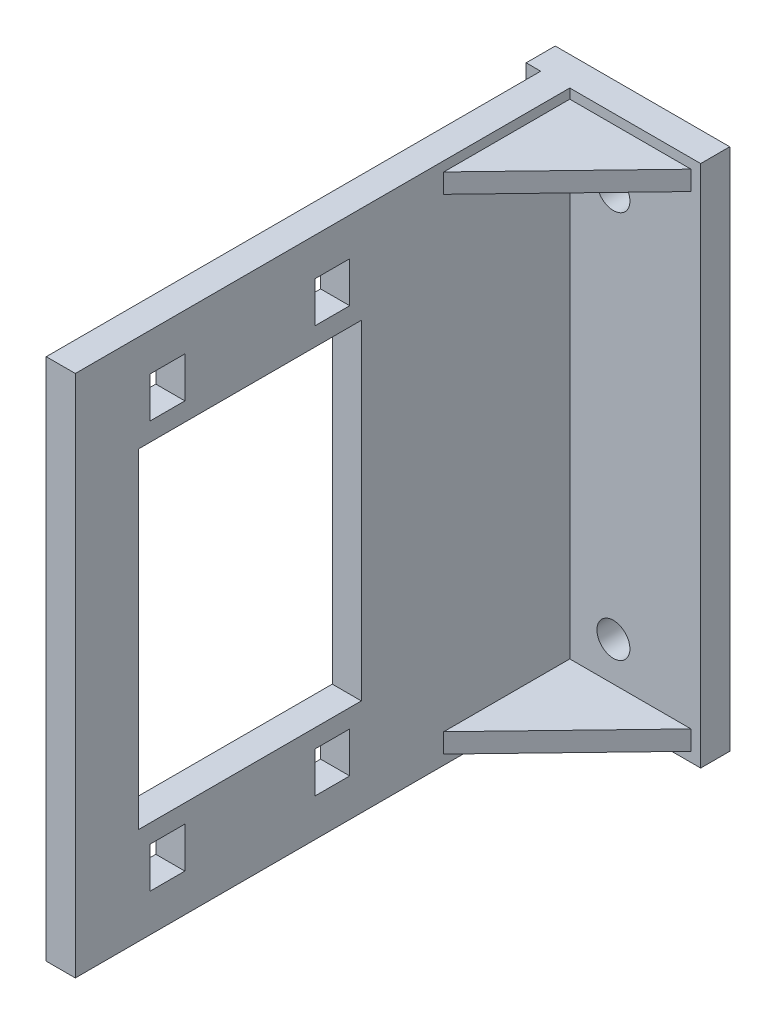
ISO-10303-21;
HEADER;
FILE_DESCRIPTION(('STEP AP214'),'2;1');
FILE_NAME('part.step','',(''),(''),'','','');
FILE_SCHEMA(('AUTOMOTIVE_DESIGN { 1 0 10303 214 1 1 1 1 }'));
ENDSEC;
DATA;
#1=APPLICATION_CONTEXT('core data for automotive mechanical design processes');
#2=APPLICATION_PROTOCOL_DEFINITION('international standard','automotive_design',2000,#1);
#3=PRODUCT_CONTEXT('',#1,'mechanical');
#4=PRODUCT('Part','Part','',(#3));
#5=PRODUCT_RELATED_PRODUCT_CATEGORY('part','',(#4));
#6=PRODUCT_DEFINITION_FORMATION('','',#4);
#7=PRODUCT_DEFINITION_CONTEXT('part definition',#1,'design');
#8=PRODUCT_DEFINITION('design','',#6,#7);
#9=PRODUCT_DEFINITION_SHAPE('','',#8);
#10=(LENGTH_UNIT() NAMED_UNIT(*) SI_UNIT(.MILLI.,.METRE.));
#11=(NAMED_UNIT(*) PLANE_ANGLE_UNIT() SI_UNIT($,.RADIAN.));
#12=(NAMED_UNIT(*) SI_UNIT($,.STERADIAN.) SOLID_ANGLE_UNIT());
#13=UNCERTAINTY_MEASURE_WITH_UNIT(LENGTH_MEASURE(1.E-05),#10,'distance_accuracy_value','');
#14=(GEOMETRIC_REPRESENTATION_CONTEXT(3) GLOBAL_UNCERTAINTY_ASSIGNED_CONTEXT((#13)) GLOBAL_UNIT_ASSIGNED_CONTEXT((#10,
#11,#12)) REPRESENTATION_CONTEXT('',''));
#15=CARTESIAN_POINT('',(0.,0.,0.));
#16=DIRECTION('',(0.,0.,1.));
#17=DIRECTION('',(1.,0.,0.));
#18=AXIS2_PLACEMENT_3D('',#15,#16,#17);
#19=CARTESIAN_POINT('',(0.,0.,3.));
#20=DIRECTION('',(0.,0.,1.));
#21=DIRECTION('',(1.,0.,0.));
#22=AXIS2_PLACEMENT_3D('',#19,#20,#21);
#23=PLANE('',#22);
#24=CARTESIAN_POINT('',(0.,-20.,3.));
#25=DIRECTION('',(0.,0.,1.));
#26=DIRECTION('',(1.,0.,0.));
#27=AXIS2_PLACEMENT_3D('',#24,#25,#26);
#28=CIRCLE('',#27,1.7);
#29=CARTESIAN_POINT('',(1.7,-20.,3.));
#30=VERTEX_POINT('',#29);
#31=EDGE_CURVE('E273',#30,#30,#28,.F.);
#32=ORIENTED_EDGE('',*,*,#31,.T.);
#33=EDGE_LOOP('',(#32));
#34=FACE_BOUND('',#33,.T.);
#35=CARTESIAN_POINT('',(0.,20.,3.));
#36=DIRECTION('',(0.,0.,1.));
#37=DIRECTION('',(1.,0.,0.));
#38=AXIS2_PLACEMENT_3D('',#35,#36,#37);
#39=CIRCLE('',#38,1.7);
#40=CARTESIAN_POINT('',(1.7,20.,3.));
#41=VERTEX_POINT('',#40);
#42=EDGE_CURVE('E511',#41,#41,#39,.F.);
#43=ORIENTED_EDGE('',*,*,#42,.T.);
#44=EDGE_LOOP('',(#43));
#45=FACE_BOUND('',#44,.T.);
#46=DIRECTION('',(0.,-1.,0.));
#47=VECTOR('',#46,1.);
#48=CARTESIAN_POINT('',(8.,26.,3.));
#49=LINE('',#48,#47);
#50=CARTESIAN_POINT('',(8.,26.,3.));
#51=VERTEX_POINT('',#50);
#52=CARTESIAN_POINT('',(8.,24.,3.));
#53=VERTEX_POINT('',#52);
#54=EDGE_CURVE('E57',#51,#53,#49,.T.);
#55=ORIENTED_EDGE('',*,*,#54,.T.);
#56=DIRECTION('',(-1.,0.,0.));
#57=VECTOR('',#56,1.);
#58=CARTESIAN_POINT('',(-4.5,24.,3.));
#59=LINE('',#58,#57);
#60=CARTESIAN_POINT('',(-4.5,24.,3.));
#61=VERTEX_POINT('',#60);
#62=EDGE_CURVE('E280',#53,#61,#59,.T.);
#63=ORIENTED_EDGE('',*,*,#62,.T.);
#64=DIRECTION('',(0.,1.,0.));
#65=VECTOR('',#64,1.);
#66=CARTESIAN_POINT('',(-4.5,-27.,3.));
#67=LINE('',#66,#65);
#68=CARTESIAN_POINT('',(-4.5,-24.,3.));
#69=VERTEX_POINT('',#68);
#70=EDGE_CURVE('E269',#69,#61,#67,.T.);
#71=ORIENTED_EDGE('',*,*,#70,.F.);
#72=DIRECTION('',(-1.,0.,0.));
#73=VECTOR('',#72,1.);
#74=CARTESIAN_POINT('',(-4.5,-24.,3.));
#75=LINE('',#74,#73);
#76=CARTESIAN_POINT('',(8.,-24.,3.));
#77=VERTEX_POINT('',#76);
#78=EDGE_CURVE('E297',#77,#69,#75,.T.);
#79=ORIENTED_EDGE('',*,*,#78,.F.);
#80=DIRECTION('',(0.,-1.,0.));
#81=VECTOR('',#80,1.);
#82=CARTESIAN_POINT('',(8.,-24.,3.));
#83=LINE('',#82,#81);
#84=CARTESIAN_POINT('',(8.,-26.,3.));
#85=VERTEX_POINT('',#84);
#86=EDGE_CURVE('E299',#77,#85,#83,.T.);
#87=ORIENTED_EDGE('',*,*,#86,.T.);
#88=DIRECTION('',(-1.,0.,0.));
#89=VECTOR('',#88,1.);
#90=CARTESIAN_POINT('',(-4.5,-26.,3.));
#91=LINE('',#90,#89);
#92=CARTESIAN_POINT('',(-4.5,-26.,3.));
#93=VERTEX_POINT('',#92);
#94=EDGE_CURVE('E293',#85,#93,#91,.T.);
#95=ORIENTED_EDGE('',*,*,#94,.T.);
#96=CARTESIAN_POINT('',(-4.5,-27.,3.));
#97=VERTEX_POINT('',#96);
#98=EDGE_CURVE('E411',#97,#93,#67,.T.);
#99=ORIENTED_EDGE('',*,*,#98,.F.);
#100=DIRECTION('',(1.,0.,0.));
#101=VECTOR('',#100,1.);
#102=CARTESIAN_POINT('',(-9.,-27.,3.));
#103=LINE('',#102,#101);
#104=CARTESIAN_POINT('',(9.,-27.,3.));
#105=VERTEX_POINT('',#104);
#106=EDGE_CURVE('E442',#97,#105,#103,.T.);
#107=ORIENTED_EDGE('',*,*,#106,.T.);
#108=DIRECTION('',(0.,1.,0.));
#109=VECTOR('',#108,1.);
#110=CARTESIAN_POINT('',(9.,-27.,3.));
#111=LINE('',#110,#109);
#112=CARTESIAN_POINT('',(9.,27.,3.));
#113=VERTEX_POINT('',#112);
#114=EDGE_CURVE('E443',#105,#113,#111,.T.);
#115=ORIENTED_EDGE('',*,*,#114,.T.);
#116=DIRECTION('',(-1.,0.,0.));
#117=VECTOR('',#116,1.);
#118=CARTESIAN_POINT('',(9.,27.,3.));
#119=LINE('',#118,#117);
#120=CARTESIAN_POINT('',(-4.5,27.,3.));
#121=VERTEX_POINT('',#120);
#122=EDGE_CURVE('E449',#113,#121,#119,.T.);
#123=ORIENTED_EDGE('',*,*,#122,.T.);
#124=CARTESIAN_POINT('',(-4.5,26.,3.));
#125=VERTEX_POINT('',#124);
#126=EDGE_CURVE('E421',#125,#121,#67,.T.);
#127=ORIENTED_EDGE('',*,*,#126,.F.);
#128=DIRECTION('',(-1.,0.,0.));
#129=VECTOR('',#128,1.);
#130=CARTESIAN_POINT('',(-4.5,26.,3.));
#131=LINE('',#130,#129);
#132=EDGE_CURVE('E61',#51,#125,#131,.T.);
#133=ORIENTED_EDGE('',*,*,#132,.F.);
#134=EDGE_LOOP('',(#55,#63,#71,#79,#87,#95,#99,#107,#115,#123,#127,#133));
#135=FACE_BOUND('',#134,.T.);
#136=ADVANCED_FACE('F39',(#34,#45,#135),#23,.T.);
#137=CARTESIAN_POINT('',(-7.5,27.,54.));
#138=DIRECTION('',(1.,0.,0.));
#139=DIRECTION('',(0.,0.,-1.));
#140=AXIS2_PLACEMENT_3D('',#137,#138,#139);
#141=PLANE('',#140);
#142=DIRECTION('',(0.,0.,1.));
#143=VECTOR('',#142,1.);
#144=CARTESIAN_POINT('',(-7.5,18.9,54.));
#145=LINE('',#144,#143);
#146=CARTESIAN_POINT('',(-7.5,18.9,25.7));
#147=VERTEX_POINT('',#146);
#148=CARTESIAN_POINT('',(-7.5,18.9,29.3));
#149=VERTEX_POINT('',#148);
#150=EDGE_CURVE('E380',#147,#149,#145,.T.);
#151=ORIENTED_EDGE('',*,*,#150,.F.);
#152=DIRECTION('',(0.,-1.,0.));
#153=VECTOR('',#152,1.);
#154=CARTESIAN_POINT('',(-7.5,27.,25.7));
#155=LINE('',#154,#153);
#156=CARTESIAN_POINT('',(-7.5,23.1,25.7));
#157=VERTEX_POINT('',#156);
#158=EDGE_CURVE('E374',#157,#147,#155,.T.);
#159=ORIENTED_EDGE('',*,*,#158,.F.);
#160=DIRECTION('',(0.,0.,-1.));
#161=VECTOR('',#160,1.);
#162=CARTESIAN_POINT('',(-7.5,23.1,54.));
#163=LINE('',#162,#161);
#164=CARTESIAN_POINT('',(-7.5,23.1,29.3));
#165=VERTEX_POINT('',#164);
#166=EDGE_CURVE('E373',#165,#157,#163,.T.);
#167=ORIENTED_EDGE('',*,*,#166,.F.);
#168=DIRECTION('',(0.,1.,0.));
#169=VECTOR('',#168,1.);
#170=CARTESIAN_POINT('',(-7.5,27.,29.3));
#171=LINE('',#170,#169);
#172=EDGE_CURVE('E371',#149,#165,#171,.T.);
#173=ORIENTED_EDGE('',*,*,#172,.F.);
#174=EDGE_LOOP('',(#151,#159,#167,#173));
#175=FACE_BOUND('',#174,.T.);
#176=DIRECTION('',(0.,0.,1.));
#177=VECTOR('',#176,1.);
#178=CARTESIAN_POINT('',(-7.5,-23.1,54.));
#179=LINE('',#178,#177);
#180=CARTESIAN_POINT('',(-7.5,-23.1,25.7));
#181=VERTEX_POINT('',#180);
#182=CARTESIAN_POINT('',(-7.5,-23.1,29.3));
#183=VERTEX_POINT('',#182);
#184=EDGE_CURVE('E356',#181,#183,#179,.T.);
#185=ORIENTED_EDGE('',*,*,#184,.F.);
#186=DIRECTION('',(0.,-1.,0.));
#187=VECTOR('',#186,1.);
#188=CARTESIAN_POINT('',(-7.5,27.,25.7));
#189=LINE('',#188,#187);
#190=CARTESIAN_POINT('',(-7.5,-18.9,25.7));
#191=VERTEX_POINT('',#190);
#192=EDGE_CURVE('E359',#191,#181,#189,.T.);
#193=ORIENTED_EDGE('',*,*,#192,.F.);
#194=DIRECTION('',(0.,0.,-1.));
#195=VECTOR('',#194,1.);
#196=CARTESIAN_POINT('',(-7.5,-18.9,54.));
#197=LINE('',#196,#195);
#198=CARTESIAN_POINT('',(-7.5,-18.9,29.3));
#199=VERTEX_POINT('',#198);
#200=EDGE_CURVE('E355',#199,#191,#197,.T.);
#201=ORIENTED_EDGE('',*,*,#200,.F.);
#202=DIRECTION('',(0.,1.,0.));
#203=VECTOR('',#202,1.);
#204=CARTESIAN_POINT('',(-7.5,27.,29.3));
#205=LINE('',#204,#203);
#206=EDGE_CURVE('E354',#183,#199,#205,.T.);
#207=ORIENTED_EDGE('',*,*,#206,.F.);
#208=EDGE_LOOP('',(#185,#193,#201,#207));
#209=FACE_BOUND('',#208,.T.);
#210=DIRECTION('',(0.,-1.,0.));
#211=VECTOR('',#210,1.);
#212=CARTESIAN_POINT('',(-7.5,27.,3.));
#213=LINE('',#212,#211);
#214=CARTESIAN_POINT('',(-7.5,27.,3.));
#215=VERTEX_POINT('',#214);
#216=CARTESIAN_POINT('',(-7.5,-27.,3.));
#217=VERTEX_POINT('',#216);
#218=EDGE_CURVE('E408',#215,#217,#213,.T.);
#219=ORIENTED_EDGE('',*,*,#218,.T.);
#220=DIRECTION('',(0.,0.,-1.));
#221=VECTOR('',#220,1.);
#222=CARTESIAN_POINT('',(-7.5,-27.,54.));
#223=LINE('',#222,#221);
#224=CARTESIAN_POINT('',(-7.5,-27.,54.));
#225=VERTEX_POINT('',#224);
#226=EDGE_CURVE('E432',#225,#217,#223,.T.);
#227=ORIENTED_EDGE('',*,*,#226,.F.);
#228=DIRECTION('',(0.,-1.,0.));
#229=VECTOR('',#228,1.);
#230=CARTESIAN_POINT('',(-7.5,27.,54.));
#231=LINE('',#230,#229);
#232=CARTESIAN_POINT('',(-7.5,27.,54.));
#233=VERTEX_POINT('',#232);
#234=EDGE_CURVE('E410',#233,#225,#231,.T.);
#235=ORIENTED_EDGE('',*,*,#234,.F.);
#236=DIRECTION('',(0.,0.,-1.));
#237=VECTOR('',#236,1.);
#238=CARTESIAN_POINT('',(-7.5,27.,54.));
#239=LINE('',#238,#237);
#240=EDGE_CURVE('E419',#233,#215,#239,.T.);
#241=ORIENTED_EDGE('',*,*,#240,.T.);
#242=EDGE_LOOP('',(#219,#227,#235,#241));
#243=FACE_BOUND('',#242,.T.);
#244=DIRECTION('',(0.,0.,1.));
#245=VECTOR('',#244,1.);
#246=CARTESIAN_POINT('',(-7.5,-17.,54.));
#247=LINE('',#246,#245);
#248=CARTESIAN_POINT('',(-7.5,-17.,24.5));
#249=VERTEX_POINT('',#248);
#250=CARTESIAN_POINT('',(-7.5,-17.,47.5));
#251=VERTEX_POINT('',#250);
#252=EDGE_CURVE('E406',#249,#251,#247,.T.);
#253=ORIENTED_EDGE('',*,*,#252,.F.);
#254=DIRECTION('',(0.,-1.,0.));
#255=VECTOR('',#254,1.);
#256=CARTESIAN_POINT('',(-7.5,27.,24.5));
#257=LINE('',#256,#255);
#258=CARTESIAN_POINT('',(-7.5,17.,24.5));
#259=VERTEX_POINT('',#258);
#260=EDGE_CURVE('E404',#259,#249,#257,.T.);
#261=ORIENTED_EDGE('',*,*,#260,.F.);
#262=DIRECTION('',(0.,0.,-1.));
#263=VECTOR('',#262,1.);
#264=CARTESIAN_POINT('',(-7.5,17.,54.));
#265=LINE('',#264,#263);
#266=CARTESIAN_POINT('',(-7.5,17.,47.5));
#267=VERTEX_POINT('',#266);
#268=EDGE_CURVE('E405',#267,#259,#265,.T.);
#269=ORIENTED_EDGE('',*,*,#268,.F.);
#270=DIRECTION('',(0.,1.,0.));
#271=VECTOR('',#270,1.);
#272=CARTESIAN_POINT('',(-7.5,27.,47.5));
#273=LINE('',#272,#271);
#274=EDGE_CURVE('E398',#251,#267,#273,.T.);
#275=ORIENTED_EDGE('',*,*,#274,.F.);
#276=EDGE_LOOP('',(#253,#261,#269,#275));
#277=FACE_BOUND('',#276,.T.);
#278=DIRECTION('',(0.,0.,1.));
#279=VECTOR('',#278,1.);
#280=CARTESIAN_POINT('',(-7.5,18.9,54.));
#281=LINE('',#280,#279);
#282=CARTESIAN_POINT('',(-7.5,18.9,42.7));
#283=VERTEX_POINT('',#282);
#284=CARTESIAN_POINT('',(-7.5,18.9,46.3));
#285=VERTEX_POINT('',#284);
#286=EDGE_CURVE('E366',#283,#285,#281,.T.);
#287=ORIENTED_EDGE('',*,*,#286,.F.);
#288=DIRECTION('',(0.,-1.,0.));
#289=VECTOR('',#288,1.);
#290=CARTESIAN_POINT('',(-7.5,27.,42.7));
#291=LINE('',#290,#289);
#292=CARTESIAN_POINT('',(-7.5,23.1,42.7));
#293=VERTEX_POINT('',#292);
#294=EDGE_CURVE('E368',#293,#283,#291,.T.);
#295=ORIENTED_EDGE('',*,*,#294,.F.);
#296=DIRECTION('',(0.,0.,-1.));
#297=VECTOR('',#296,1.);
#298=CARTESIAN_POINT('',(-7.5,23.1,54.));
#299=LINE('',#298,#297);
#300=CARTESIAN_POINT('',(-7.5,23.1,46.3));
#301=VERTEX_POINT('',#300);
#302=EDGE_CURVE('E365',#301,#293,#299,.T.);
#303=ORIENTED_EDGE('',*,*,#302,.F.);
#304=DIRECTION('',(0.,1.,0.));
#305=VECTOR('',#304,1.);
#306=CARTESIAN_POINT('',(-7.5,27.,46.3));
#307=LINE('',#306,#305);
#308=EDGE_CURVE('E362',#285,#301,#307,.T.);
#309=ORIENTED_EDGE('',*,*,#308,.F.);
#310=EDGE_LOOP('',(#287,#295,#303,#309));
#311=FACE_BOUND('',#310,.T.);
#312=DIRECTION('',(0.,0.,1.));
#313=VECTOR('',#312,1.);
#314=CARTESIAN_POINT('',(-7.5,-23.1,54.));
#315=LINE('',#314,#313);
#316=CARTESIAN_POINT('',(-7.5,-23.1,42.7));
#317=VERTEX_POINT('',#316);
#318=CARTESIAN_POINT('',(-7.5,-23.1,46.3));
#319=VERTEX_POINT('',#318);
#320=EDGE_CURVE('E387',#317,#319,#315,.T.);
#321=ORIENTED_EDGE('',*,*,#320,.F.);
#322=DIRECTION('',(0.,-1.,0.));
#323=VECTOR('',#322,1.);
#324=CARTESIAN_POINT('',(-7.5,27.,42.7));
#325=LINE('',#324,#323);
#326=CARTESIAN_POINT('',(-7.5,-18.9,42.7));
#327=VERTEX_POINT('',#326);
#328=EDGE_CURVE('E383',#327,#317,#325,.T.);
#329=ORIENTED_EDGE('',*,*,#328,.F.);
#330=DIRECTION('',(0.,0.,-1.));
#331=VECTOR('',#330,1.);
#332=CARTESIAN_POINT('',(-7.5,-18.9,54.));
#333=LINE('',#332,#331);
#334=CARTESIAN_POINT('',(-7.5,-18.9,46.3));
#335=VERTEX_POINT('',#334);
#336=EDGE_CURVE('E385',#335,#327,#333,.T.);
#337=ORIENTED_EDGE('',*,*,#336,.F.);
#338=DIRECTION('',(0.,1.,0.));
#339=VECTOR('',#338,1.);
#340=CARTESIAN_POINT('',(-7.5,27.,46.3));
#341=LINE('',#340,#339);
#342=EDGE_CURVE('E379',#319,#335,#341,.T.);
#343=ORIENTED_EDGE('',*,*,#342,.F.);
#344=EDGE_LOOP('',(#321,#329,#337,#343));
#345=FACE_BOUND('',#344,.T.);
#346=ADVANCED_FACE('F567',(#175,#209,#243,#277,#311,#345),#141,.F.);
#347=CARTESIAN_POINT('',(-4.5,-27.,54.));
#348=DIRECTION('',(-1.,0.,0.));
#349=DIRECTION('',(0.,0.,1.));
#350=AXIS2_PLACEMENT_3D('',#347,#348,#349);
#351=PLANE('',#350);
#352=DIRECTION('',(0.,0.,-1.));
#353=VECTOR('',#352,1.);
#354=CARTESIAN_POINT('',(-4.5,18.9,54.));
#355=LINE('',#354,#353);
#356=CARTESIAN_POINT('',(-4.5,18.9,29.3));
#357=VERTEX_POINT('',#356);
#358=CARTESIAN_POINT('',(-4.5,18.9,25.7));
#359=VERTEX_POINT('',#358);
#360=EDGE_CURVE('E503',#357,#359,#355,.T.);
#361=ORIENTED_EDGE('',*,*,#360,.F.);
#362=DIRECTION('',(0.,-1.,0.));
#363=VECTOR('',#362,1.);
#364=CARTESIAN_POINT('',(-4.5,-27.,29.3));
#365=LINE('',#364,#363);
#366=CARTESIAN_POINT('',(-4.5,23.1,29.3));
#367=VERTEX_POINT('',#366);
#368=EDGE_CURVE('E500',#367,#357,#365,.T.);
#369=ORIENTED_EDGE('',*,*,#368,.F.);
#370=DIRECTION('',(0.,0.,1.));
#371=VECTOR('',#370,1.);
#372=CARTESIAN_POINT('',(-4.5,23.1,54.));
#373=LINE('',#372,#371);
#374=CARTESIAN_POINT('',(-4.5,23.1,25.7));
#375=VERTEX_POINT('',#374);
#376=EDGE_CURVE('E496',#375,#367,#373,.T.);
#377=ORIENTED_EDGE('',*,*,#376,.F.);
#378=DIRECTION('',(0.,1.,0.));
#379=VECTOR('',#378,1.);
#380=CARTESIAN_POINT('',(-4.5,-27.,25.7));
#381=LINE('',#380,#379);
#382=EDGE_CURVE('E502',#359,#375,#381,.T.);
#383=ORIENTED_EDGE('',*,*,#382,.F.);
#384=EDGE_LOOP('',(#361,#369,#377,#383));
#385=FACE_BOUND('',#384,.T.);
#386=DIRECTION('',(0.,0.,-1.));
#387=VECTOR('',#386,1.);
#388=CARTESIAN_POINT('',(-4.5,-23.1,54.));
#389=LINE('',#388,#387);
#390=CARTESIAN_POINT('',(-4.5,-23.1,29.3));
#391=VERTEX_POINT('',#390);
#392=CARTESIAN_POINT('',(-4.5,-23.1,25.7));
#393=VERTEX_POINT('',#392);
#394=EDGE_CURVE('E486',#391,#393,#389,.T.);
#395=ORIENTED_EDGE('',*,*,#394,.F.);
#396=DIRECTION('',(0.,-1.,0.));
#397=VECTOR('',#396,1.);
#398=CARTESIAN_POINT('',(-4.5,-27.,29.3));
#399=LINE('',#398,#397);
#400=CARTESIAN_POINT('',(-4.5,-18.9,29.3));
#401=VERTEX_POINT('',#400);
#402=EDGE_CURVE('E479',#401,#391,#399,.T.);
#403=ORIENTED_EDGE('',*,*,#402,.F.);
#404=DIRECTION('',(0.,0.,1.));
#405=VECTOR('',#404,1.);
#406=CARTESIAN_POINT('',(-4.5,-18.9,54.));
#407=LINE('',#406,#405);
#408=CARTESIAN_POINT('',(-4.5,-18.9,25.7));
#409=VERTEX_POINT('',#408);
#410=EDGE_CURVE('E481',#409,#401,#407,.T.);
#411=ORIENTED_EDGE('',*,*,#410,.F.);
#412=DIRECTION('',(0.,1.,0.));
#413=VECTOR('',#412,1.);
#414=CARTESIAN_POINT('',(-4.5,-27.,25.7));
#415=LINE('',#414,#413);
#416=EDGE_CURVE('E482',#393,#409,#415,.T.);
#417=ORIENTED_EDGE('',*,*,#416,.F.);
#418=EDGE_LOOP('',(#395,#403,#411,#417));
#419=FACE_BOUND('',#418,.T.);
#420=ORIENTED_EDGE('',*,*,#70,.T.);
#421=DIRECTION('',(0.,0.,1.));
#422=VECTOR('',#421,1.);
#423=CARTESIAN_POINT('',(-4.5,24.,16.));
#424=LINE('',#423,#422);
#425=CARTESIAN_POINT('',(-4.5,24.,16.));
#426=VERTEX_POINT('',#425);
#427=EDGE_CURVE('E261',#61,#426,#424,.T.);
#428=ORIENTED_EDGE('',*,*,#427,.T.);
#429=DIRECTION('',(0.,-1.,0.));
#430=VECTOR('',#429,1.);
#431=CARTESIAN_POINT('',(-4.5,26.,16.));
#432=LINE('',#431,#430);
#433=CARTESIAN_POINT('',(-4.5,26.,16.));
#434=VERTEX_POINT('',#433);
#435=EDGE_CURVE('E266',#434,#426,#432,.T.);
#436=ORIENTED_EDGE('',*,*,#435,.F.);
#437=DIRECTION('',(0.,0.,1.));
#438=VECTOR('',#437,1.);
#439=CARTESIAN_POINT('',(-4.5,26.,16.));
#440=LINE('',#439,#438);
#441=EDGE_CURVE('E521',#125,#434,#440,.T.);
#442=ORIENTED_EDGE('',*,*,#441,.F.);
#443=ORIENTED_EDGE('',*,*,#126,.T.);
#444=DIRECTION('',(0.,0.,-1.));
#445=VECTOR('',#444,1.);
#446=CARTESIAN_POINT('',(-4.5,27.,54.));
#447=LINE('',#446,#445);
#448=CARTESIAN_POINT('',(-4.5,27.,54.));
#449=VERTEX_POINT('',#448);
#450=EDGE_CURVE('E428',#449,#121,#447,.T.);
#451=ORIENTED_EDGE('',*,*,#450,.F.);
#452=DIRECTION('',(0.,1.,0.));
#453=VECTOR('',#452,1.);
#454=CARTESIAN_POINT('',(-4.5,-27.,54.));
#455=LINE('',#454,#453);
#456=CARTESIAN_POINT('',(-4.5,-27.,54.));
#457=VERTEX_POINT('',#456);
#458=EDGE_CURVE('E418',#457,#449,#455,.T.);
#459=ORIENTED_EDGE('',*,*,#458,.F.);
#460=DIRECTION('',(0.,0.,-1.));
#461=VECTOR('',#460,1.);
#462=CARTESIAN_POINT('',(-4.5,-27.,54.));
#463=LINE('',#462,#461);
#464=EDGE_CURVE('E431',#457,#97,#463,.T.);
#465=ORIENTED_EDGE('',*,*,#464,.T.);
#466=ORIENTED_EDGE('',*,*,#98,.T.);
#467=DIRECTION('',(0.,0.,1.));
#468=VECTOR('',#467,1.);
#469=CARTESIAN_POINT('',(-4.5,-26.,16.));
#470=LINE('',#469,#468);
#471=CARTESIAN_POINT('',(-4.5,-26.,16.));
#472=VERTEX_POINT('',#471);
#473=EDGE_CURVE('E284',#93,#472,#470,.T.);
#474=ORIENTED_EDGE('',*,*,#473,.T.);
#475=DIRECTION('',(0.,-1.,0.));
#476=VECTOR('',#475,1.);
#477=CARTESIAN_POINT('',(-4.5,-24.,16.));
#478=LINE('',#477,#476);
#479=CARTESIAN_POINT('',(-4.5,-24.,16.));
#480=VERTEX_POINT('',#479);
#481=EDGE_CURVE('E308',#480,#472,#478,.T.);
#482=ORIENTED_EDGE('',*,*,#481,.F.);
#483=DIRECTION('',(0.,0.,1.));
#484=VECTOR('',#483,1.);
#485=CARTESIAN_POINT('',(-4.5,-24.,16.));
#486=LINE('',#485,#484);
#487=EDGE_CURVE('E292',#69,#480,#486,.T.);
#488=ORIENTED_EDGE('',*,*,#487,.F.);
#489=EDGE_LOOP('',(#420,#428,#436,#442,#443,#451,#459,#465,#466,#474,#482,#488));
#490=FACE_BOUND('',#489,.T.);
#491=DIRECTION('',(0.,0.,-1.));
#492=VECTOR('',#491,1.);
#493=CARTESIAN_POINT('',(-4.5,-17.,54.));
#494=LINE('',#493,#492);
#495=CARTESIAN_POINT('',(-4.5,-17.,47.5));
#496=VERTEX_POINT('',#495);
#497=CARTESIAN_POINT('',(-4.5,-17.,24.5));
#498=VERTEX_POINT('',#497);
#499=EDGE_CURVE('E480',#496,#498,#494,.T.);
#500=ORIENTED_EDGE('',*,*,#499,.F.);
#501=DIRECTION('',(0.,-1.,0.));
#502=VECTOR('',#501,1.);
#503=CARTESIAN_POINT('',(-4.5,-27.,47.5));
#504=LINE('',#503,#502);
#505=CARTESIAN_POINT('',(-4.5,17.,47.5));
#506=VERTEX_POINT('',#505);
#507=EDGE_CURVE('E468',#506,#496,#504,.T.);
#508=ORIENTED_EDGE('',*,*,#507,.F.);
#509=DIRECTION('',(0.,0.,1.));
#510=VECTOR('',#509,1.);
#511=CARTESIAN_POINT('',(-4.5,17.,54.));
#512=LINE('',#511,#510);
#513=CARTESIAN_POINT('',(-4.5,17.,24.5));
#514=VERTEX_POINT('',#513);
#515=EDGE_CURVE('E472',#514,#506,#512,.T.);
#516=ORIENTED_EDGE('',*,*,#515,.F.);
#517=DIRECTION('',(0.,1.,0.));
#518=VECTOR('',#517,1.);
#519=CARTESIAN_POINT('',(-4.5,-27.,24.5));
#520=LINE('',#519,#518);
#521=EDGE_CURVE('E474',#498,#514,#520,.T.);
#522=ORIENTED_EDGE('',*,*,#521,.F.);
#523=EDGE_LOOP('',(#500,#508,#516,#522));
#524=FACE_BOUND('',#523,.T.);
#525=DIRECTION('',(0.,0.,-1.));
#526=VECTOR('',#525,1.);
#527=CARTESIAN_POINT('',(-4.5,18.9,54.));
#528=LINE('',#527,#526);
#529=CARTESIAN_POINT('',(-4.5,18.9,46.3));
#530=VERTEX_POINT('',#529);
#531=CARTESIAN_POINT('',(-4.5,18.9,42.7));
#532=VERTEX_POINT('',#531);
#533=EDGE_CURVE('E494',#530,#532,#528,.T.);
#534=ORIENTED_EDGE('',*,*,#533,.F.);
#535=DIRECTION('',(0.,-1.,0.));
#536=VECTOR('',#535,1.);
#537=CARTESIAN_POINT('',(-4.5,-27.,46.3));
#538=LINE('',#537,#536);
#539=CARTESIAN_POINT('',(-4.5,23.1,46.3));
#540=VERTEX_POINT('',#539);
#541=EDGE_CURVE('E488',#540,#530,#538,.T.);
#542=ORIENTED_EDGE('',*,*,#541,.F.);
#543=DIRECTION('',(0.,0.,1.));
#544=VECTOR('',#543,1.);
#545=CARTESIAN_POINT('',(-4.5,23.1,54.));
#546=LINE('',#545,#544);
#547=CARTESIAN_POINT('',(-4.5,23.1,42.7));
#548=VERTEX_POINT('',#547);
#549=EDGE_CURVE('E489',#548,#540,#546,.T.);
#550=ORIENTED_EDGE('',*,*,#549,.F.);
#551=DIRECTION('',(0.,1.,0.));
#552=VECTOR('',#551,1.);
#553=CARTESIAN_POINT('',(-4.5,-27.,42.7));
#554=LINE('',#553,#552);
#555=EDGE_CURVE('E492',#532,#548,#554,.T.);
#556=ORIENTED_EDGE('',*,*,#555,.F.);
#557=EDGE_LOOP('',(#534,#542,#550,#556));
#558=FACE_BOUND('',#557,.T.);
#559=DIRECTION('',(0.,0.,-1.));
#560=VECTOR('',#559,1.);
#561=CARTESIAN_POINT('',(-4.5,-23.1,54.));
#562=LINE('',#561,#560);
#563=CARTESIAN_POINT('',(-4.5,-23.1,46.3));
#564=VERTEX_POINT('',#563);
#565=CARTESIAN_POINT('',(-4.5,-23.1,42.7));
#566=VERTEX_POINT('',#565);
#567=EDGE_CURVE('E11',#564,#566,#562,.T.);
#568=ORIENTED_EDGE('',*,*,#567,.F.);
#569=DIRECTION('',(0.,-1.,0.));
#570=VECTOR('',#569,1.);
#571=CARTESIAN_POINT('',(-4.5,-27.,46.3));
#572=LINE('',#571,#570);
#573=CARTESIAN_POINT('',(-4.5,-18.9,46.3));
#574=VERTEX_POINT('',#573);
#575=EDGE_CURVE('E507',#574,#564,#572,.T.);
#576=ORIENTED_EDGE('',*,*,#575,.F.);
#577=DIRECTION('',(0.,0.,1.));
#578=VECTOR('',#577,1.);
#579=CARTESIAN_POINT('',(-4.5,-18.9,54.));
#580=LINE('',#579,#578);
#581=CARTESIAN_POINT('',(-4.5,-18.9,42.7));
#582=VERTEX_POINT('',#581);
#583=EDGE_CURVE('E510',#582,#574,#580,.T.);
#584=ORIENTED_EDGE('',*,*,#583,.F.);
#585=DIRECTION('',(0.,1.,0.));
#586=VECTOR('',#585,1.);
#587=CARTESIAN_POINT('',(-4.5,-27.,42.7));
#588=LINE('',#587,#586);
#589=EDGE_CURVE('E48',#566,#582,#588,.T.);
#590=ORIENTED_EDGE('',*,*,#589,.F.);
#591=EDGE_LOOP('',(#568,#576,#584,#590));
#592=FACE_BOUND('',#591,.T.);
#593=ADVANCED_FACE('F263',(#385,#419,#490,#524,#558,#592),#351,.F.);
#594=ORIENTED_EDGE('',*,*,#218,.F.);
#595=CARTESIAN_POINT('',(-9.,27.,3.));
#596=VERTEX_POINT('',#595);
#597=EDGE_CURVE('E447',#215,#596,#119,.T.);
#598=ORIENTED_EDGE('',*,*,#597,.T.);
#599=DIRECTION('',(0.,-1.,0.));
#600=VECTOR('',#599,1.);
#601=CARTESIAN_POINT('',(-9.,27.,3.));
#602=LINE('',#601,#600);
#603=CARTESIAN_POINT('',(-9.,-27.,3.));
#604=VERTEX_POINT('',#603);
#605=EDGE_CURVE('E437',#596,#604,#602,.T.);
#606=ORIENTED_EDGE('',*,*,#605,.T.);
#607=EDGE_CURVE('E444',#604,#217,#103,.T.);
#608=ORIENTED_EDGE('',*,*,#607,.T.);
#609=EDGE_LOOP('',(#594,#598,#606,#608));
#610=FACE_BOUND('',#609,.T.);
#611=ADVANCED_FACE('F569',(#610),#23,.T.);
#612=CARTESIAN_POINT('',(-9.,27.,3.));
#613=DIRECTION('',(1.,0.,0.));
#614=DIRECTION('',(0.,0.,-1.));
#615=AXIS2_PLACEMENT_3D('',#612,#613,#614);
#616=PLANE('',#615);
#617=DIRECTION('',(0.,-1.,0.));
#618=VECTOR('',#617,1.);
#619=CARTESIAN_POINT('',(-9.,27.,0.));
#620=LINE('',#619,#618);
#621=CARTESIAN_POINT('',(-9.,27.,0.));
#622=VERTEX_POINT('',#621);
#623=CARTESIAN_POINT('',(-9.,-27.,0.));
#624=VERTEX_POINT('',#623);
#625=EDGE_CURVE('E440',#622,#624,#620,.T.);
#626=ORIENTED_EDGE('',*,*,#625,.T.);
#627=DIRECTION('',(0.,0.,-1.));
#628=VECTOR('',#627,1.);
#629=CARTESIAN_POINT('',(-9.,-27.,3.));
#630=LINE('',#629,#628);
#631=EDGE_CURVE('E469',#604,#624,#630,.T.);
#632=ORIENTED_EDGE('',*,*,#631,.F.);
#633=ORIENTED_EDGE('',*,*,#605,.F.);
#634=DIRECTION('',(0.,0.,-1.));
#635=VECTOR('',#634,1.);
#636=CARTESIAN_POINT('',(-9.,27.,3.));
#637=LINE('',#636,#635);
#638=EDGE_CURVE('E452',#596,#622,#637,.T.);
#639=ORIENTED_EDGE('',*,*,#638,.T.);
#640=EDGE_LOOP('',(#626,#632,#633,#639));
#641=FACE_BOUND('',#640,.T.);
#642=ADVANCED_FACE('F41',(#641),#616,.F.);
#643=CARTESIAN_POINT('',(-9.,-27.,3.));
#644=DIRECTION('',(0.,1.,0.));
#645=DIRECTION('',(0.,0.,1.));
#646=AXIS2_PLACEMENT_3D('',#643,#644,#645);
#647=PLANE('',#646);
#648=DIRECTION('',(1.,0.,0.));
#649=VECTOR('',#648,1.);
#650=CARTESIAN_POINT('',(-9.,-27.,0.));
#651=LINE('',#650,#649);
#652=CARTESIAN_POINT('',(9.,-27.,0.));
#653=VERTEX_POINT('',#652);
#654=EDGE_CURVE('E451',#624,#653,#651,.T.);
#655=ORIENTED_EDGE('',*,*,#654,.T.);
#656=DIRECTION('',(0.,0.,-1.));
#657=VECTOR('',#656,1.);
#658=CARTESIAN_POINT('',(9.,-27.,3.));
#659=LINE('',#658,#657);
#660=EDGE_CURVE('E463',#105,#653,#659,.T.);
#661=ORIENTED_EDGE('',*,*,#660,.F.);
#662=ORIENTED_EDGE('',*,*,#106,.F.);
#663=ORIENTED_EDGE('',*,*,#464,.F.);
#664=DIRECTION('',(1.,0.,0.));
#665=VECTOR('',#664,1.);
#666=CARTESIAN_POINT('',(-7.5,-27.,54.));
#667=LINE('',#666,#665);
#668=EDGE_CURVE('E415',#225,#457,#667,.T.);
#669=ORIENTED_EDGE('',*,*,#668,.F.);
#670=ORIENTED_EDGE('',*,*,#226,.T.);
#671=ORIENTED_EDGE('',*,*,#607,.F.);
#672=ORIENTED_EDGE('',*,*,#631,.T.);
#673=EDGE_LOOP('',(#655,#661,#662,#663,#669,#670,#671,#672));
#674=FACE_BOUND('',#673,.T.);
#675=ADVANCED_FACE('F544',(#674),#647,.F.);
#676=CARTESIAN_POINT('',(9.,-27.,3.));
#677=DIRECTION('',(-1.,0.,0.));
#678=DIRECTION('',(0.,0.,1.));
#679=AXIS2_PLACEMENT_3D('',#676,#677,#678);
#680=PLANE('',#679);
#681=DIRECTION('',(0.,1.,0.));
#682=VECTOR('',#681,1.);
#683=CARTESIAN_POINT('',(9.,-27.,0.));
#684=LINE('',#683,#682);
#685=CARTESIAN_POINT('',(9.,27.,0.));
#686=VERTEX_POINT('',#685);
#687=EDGE_CURVE('E457',#653,#686,#684,.T.);
#688=ORIENTED_EDGE('',*,*,#687,.T.);
#689=DIRECTION('',(0.,0.,-1.));
#690=VECTOR('',#689,1.);
#691=CARTESIAN_POINT('',(9.,27.,3.));
#692=LINE('',#691,#690);
#693=EDGE_CURVE('E461',#113,#686,#692,.T.);
#694=ORIENTED_EDGE('',*,*,#693,.F.);
#695=ORIENTED_EDGE('',*,*,#114,.F.);
#696=ORIENTED_EDGE('',*,*,#660,.T.);
#697=EDGE_LOOP('',(#688,#694,#695,#696));
#698=FACE_BOUND('',#697,.T.);
#699=ADVANCED_FACE('F599',(#698),#680,.F.);
#700=CARTESIAN_POINT('',(9.,27.,3.));
#701=DIRECTION('',(0.,-1.,0.));
#702=DIRECTION('',(0.,0.,-1.));
#703=AXIS2_PLACEMENT_3D('',#700,#701,#702);
#704=PLANE('',#703);
#705=DIRECTION('',(-1.,0.,0.));
#706=VECTOR('',#705,1.);
#707=CARTESIAN_POINT('',(9.,27.,0.));
#708=LINE('',#707,#706);
#709=EDGE_CURVE('E445',#686,#622,#708,.T.);
#710=ORIENTED_EDGE('',*,*,#709,.T.);
#711=ORIENTED_EDGE('',*,*,#638,.F.);
#712=ORIENTED_EDGE('',*,*,#597,.F.);
#713=ORIENTED_EDGE('',*,*,#240,.F.);
#714=DIRECTION('',(-1.,0.,0.));
#715=VECTOR('',#714,1.);
#716=CARTESIAN_POINT('',(-4.5,27.,54.));
#717=LINE('',#716,#715);
#718=EDGE_CURVE('E416',#449,#233,#717,.T.);
#719=ORIENTED_EDGE('',*,*,#718,.F.);
#720=ORIENTED_EDGE('',*,*,#450,.T.);
#721=ORIENTED_EDGE('',*,*,#122,.F.);
#722=ORIENTED_EDGE('',*,*,#693,.T.);
#723=EDGE_LOOP('',(#710,#711,#712,#713,#719,#720,#721,#722));
#724=FACE_BOUND('',#723,.T.);
#725=ADVANCED_FACE('F532',(#724),#704,.F.);
#726=CARTESIAN_POINT('',(0.,0.,0.));
#727=DIRECTION('',(0.,0.,1.));
#728=DIRECTION('',(1.,0.,0.));
#729=AXIS2_PLACEMENT_3D('',#726,#727,#728);
#730=PLANE('',#729);
#731=CARTESIAN_POINT('',(0.,-20.,0.));
#732=DIRECTION('',(0.,0.,1.));
#733=DIRECTION('',(1.,0.,0.));
#734=AXIS2_PLACEMENT_3D('',#731,#732,#733);
#735=CIRCLE('',#734,1.7);
#736=CARTESIAN_POINT('',(1.7,-20.,0.));
#737=VERTEX_POINT('',#736);
#738=EDGE_CURVE('E43',#737,#737,#735,.F.);
#739=ORIENTED_EDGE('',*,*,#738,.F.);
#740=EDGE_LOOP('',(#739));
#741=FACE_BOUND('',#740,.T.);
#742=CARTESIAN_POINT('',(0.,20.,0.));
#743=DIRECTION('',(0.,0.,1.));
#744=DIRECTION('',(1.,0.,0.));
#745=AXIS2_PLACEMENT_3D('',#742,#743,#744);
#746=CIRCLE('',#745,1.7);
#747=CARTESIAN_POINT('',(1.7,20.,0.));
#748=VERTEX_POINT('',#747);
#749=EDGE_CURVE('E512',#748,#748,#746,.F.);
#750=ORIENTED_EDGE('',*,*,#749,.F.);
#751=EDGE_LOOP('',(#750));
#752=FACE_BOUND('',#751,.T.);
#753=ORIENTED_EDGE('',*,*,#625,.F.);
#754=ORIENTED_EDGE('',*,*,#709,.F.);
#755=ORIENTED_EDGE('',*,*,#687,.F.);
#756=ORIENTED_EDGE('',*,*,#654,.F.);
#757=EDGE_LOOP('',(#753,#754,#755,#756));
#758=FACE_BOUND('',#757,.T.);
#759=ADVANCED_FACE('F600',(#741,#752,#758),#730,.F.);
#760=CARTESIAN_POINT('',(0.,0.,54.));
#761=DIRECTION('',(0.,0.,1.));
#762=DIRECTION('',(1.,0.,0.));
#763=AXIS2_PLACEMENT_3D('',#760,#761,#762);
#764=PLANE('',#763);
#765=ORIENTED_EDGE('',*,*,#234,.T.);
#766=ORIENTED_EDGE('',*,*,#668,.T.);
#767=ORIENTED_EDGE('',*,*,#458,.T.);
#768=ORIENTED_EDGE('',*,*,#718,.T.);
#769=EDGE_LOOP('',(#765,#766,#767,#768));
#770=FACE_BOUND('',#769,.T.);
#771=ADVANCED_FACE('F539',(#770),#764,.T.);
#772=CARTESIAN_POINT('',(-3.,-17.,47.5));
#773=DIRECTION('',(0.,1.,0.));
#774=DIRECTION('',(0.,0.,1.));
#775=AXIS2_PLACEMENT_3D('',#772,#773,#774);
#776=PLANE('',#775);
#777=ORIENTED_EDGE('',*,*,#252,.T.);
#778=DIRECTION('',(-1.,0.,0.));
#779=VECTOR('',#778,1.);
#780=CARTESIAN_POINT('',(-3.,-17.,47.5));
#781=LINE('',#780,#779);
#782=EDGE_CURVE('E386',#496,#251,#781,.T.);
#783=ORIENTED_EDGE('',*,*,#782,.F.);
#784=ORIENTED_EDGE('',*,*,#499,.T.);
#785=DIRECTION('',(-1.,0.,0.));
#786=VECTOR('',#785,1.);
#787=CARTESIAN_POINT('',(-3.,-17.,24.5));
#788=LINE('',#787,#786);
#789=EDGE_CURVE('E399',#498,#249,#788,.T.);
#790=ORIENTED_EDGE('',*,*,#789,.T.);
#791=EDGE_LOOP('',(#777,#783,#784,#790));
#792=FACE_BOUND('',#791,.T.);
#793=ADVANCED_FACE('F611',(#792),#776,.T.);
#794=CARTESIAN_POINT('',(-3.,-17.,24.5));
#795=DIRECTION('',(0.,0.,1.));
#796=DIRECTION('',(1.,0.,0.));
#797=AXIS2_PLACEMENT_3D('',#794,#795,#796);
#798=PLANE('',#797);
#799=ORIENTED_EDGE('',*,*,#260,.T.);
#800=ORIENTED_EDGE('',*,*,#789,.F.);
#801=ORIENTED_EDGE('',*,*,#521,.T.);
#802=DIRECTION('',(-1.,0.,0.));
#803=VECTOR('',#802,1.);
#804=CARTESIAN_POINT('',(-3.,17.,24.5));
#805=LINE('',#804,#803);
#806=EDGE_CURVE('E393',#514,#259,#805,.T.);
#807=ORIENTED_EDGE('',*,*,#806,.T.);
#808=EDGE_LOOP('',(#799,#800,#801,#807));
#809=FACE_BOUND('',#808,.T.);
#810=ADVANCED_FACE('F849',(#809),#798,.T.);
#811=CARTESIAN_POINT('',(-3.,17.,24.5));
#812=DIRECTION('',(0.,-1.,0.));
#813=DIRECTION('',(0.,0.,-1.));
#814=AXIS2_PLACEMENT_3D('',#811,#812,#813);
#815=PLANE('',#814);
#816=ORIENTED_EDGE('',*,*,#268,.T.);
#817=ORIENTED_EDGE('',*,*,#806,.F.);
#818=ORIENTED_EDGE('',*,*,#515,.T.);
#819=DIRECTION('',(-1.,0.,0.));
#820=VECTOR('',#819,1.);
#821=CARTESIAN_POINT('',(-3.,17.,47.5));
#822=LINE('',#821,#820);
#823=EDGE_CURVE('E391',#506,#267,#822,.T.);
#824=ORIENTED_EDGE('',*,*,#823,.T.);
#825=EDGE_LOOP('',(#816,#817,#818,#824));
#826=FACE_BOUND('',#825,.T.);
#827=ADVANCED_FACE('F836',(#826),#815,.T.);
#828=CARTESIAN_POINT('',(-3.,17.,47.5));
#829=DIRECTION('',(0.,0.,-1.));
#830=DIRECTION('',(-1.,0.,0.));
#831=AXIS2_PLACEMENT_3D('',#828,#829,#830);
#832=PLANE('',#831);
#833=ORIENTED_EDGE('',*,*,#274,.T.);
#834=ORIENTED_EDGE('',*,*,#823,.F.);
#835=ORIENTED_EDGE('',*,*,#507,.T.);
#836=ORIENTED_EDGE('',*,*,#782,.T.);
#837=EDGE_LOOP('',(#833,#834,#835,#836));
#838=FACE_BOUND('',#837,.T.);
#839=ADVANCED_FACE('F819',(#838),#832,.T.);
#840=CARTESIAN_POINT('',(-3.,-23.1,29.3));
#841=DIRECTION('',(0.,1.,0.));
#842=DIRECTION('',(0.,0.,1.));
#843=AXIS2_PLACEMENT_3D('',#840,#841,#842);
#844=PLANE('',#843);
#845=ORIENTED_EDGE('',*,*,#184,.T.);
#846=DIRECTION('',(-1.,0.,0.));
#847=VECTOR('',#846,1.);
#848=CARTESIAN_POINT('',(-3.,-23.1,29.3));
#849=LINE('',#848,#847);
#850=EDGE_CURVE('E334',#391,#183,#849,.T.);
#851=ORIENTED_EDGE('',*,*,#850,.F.);
#852=ORIENTED_EDGE('',*,*,#394,.T.);
#853=DIRECTION('',(-1.,0.,0.));
#854=VECTOR('',#853,1.);
#855=CARTESIAN_POINT('',(-3.,-23.1,25.7));
#856=LINE('',#855,#854);
#857=EDGE_CURVE('E348',#393,#181,#856,.T.);
#858=ORIENTED_EDGE('',*,*,#857,.T.);
#859=EDGE_LOOP('',(#845,#851,#852,#858));
#860=FACE_BOUND('',#859,.T.);
#861=ADVANCED_FACE('F811',(#860),#844,.T.);
#862=CARTESIAN_POINT('',(-3.,-23.1,25.7));
#863=DIRECTION('',(0.,0.,1.));
#864=DIRECTION('',(1.,0.,0.));
#865=AXIS2_PLACEMENT_3D('',#862,#863,#864);
#866=PLANE('',#865);
#867=ORIENTED_EDGE('',*,*,#192,.T.);
#868=ORIENTED_EDGE('',*,*,#857,.F.);
#869=ORIENTED_EDGE('',*,*,#416,.T.);
#870=DIRECTION('',(-1.,0.,0.));
#871=VECTOR('',#870,1.);
#872=CARTESIAN_POINT('',(-3.,-18.9,25.7));
#873=LINE('',#872,#871);
#874=EDGE_CURVE('E350',#409,#191,#873,.T.);
#875=ORIENTED_EDGE('',*,*,#874,.T.);
#876=EDGE_LOOP('',(#867,#868,#869,#875));
#877=FACE_BOUND('',#876,.T.);
#878=ADVANCED_FACE('F802',(#877),#866,.T.);
#879=CARTESIAN_POINT('',(-3.,-18.9,25.7));
#880=DIRECTION('',(0.,-1.,0.));
#881=DIRECTION('',(0.,0.,-1.));
#882=AXIS2_PLACEMENT_3D('',#879,#880,#881);
#883=PLANE('',#882);
#884=ORIENTED_EDGE('',*,*,#200,.T.);
#885=ORIENTED_EDGE('',*,*,#874,.F.);
#886=ORIENTED_EDGE('',*,*,#410,.T.);
#887=DIRECTION('',(-1.,0.,0.));
#888=VECTOR('',#887,1.);
#889=CARTESIAN_POINT('',(-3.,-18.9,29.3));
#890=LINE('',#889,#888);
#891=EDGE_CURVE('E341',#401,#199,#890,.T.);
#892=ORIENTED_EDGE('',*,*,#891,.T.);
#893=EDGE_LOOP('',(#884,#885,#886,#892));
#894=FACE_BOUND('',#893,.T.);
#895=ADVANCED_FACE('F794',(#894),#883,.T.);
#896=CARTESIAN_POINT('',(-3.,-18.9,29.3));
#897=DIRECTION('',(0.,0.,-1.));
#898=DIRECTION('',(-1.,0.,0.));
#899=AXIS2_PLACEMENT_3D('',#896,#897,#898);
#900=PLANE('',#899);
#901=ORIENTED_EDGE('',*,*,#206,.T.);
#902=ORIENTED_EDGE('',*,*,#891,.F.);
#903=ORIENTED_EDGE('',*,*,#402,.T.);
#904=ORIENTED_EDGE('',*,*,#850,.T.);
#905=EDGE_LOOP('',(#901,#902,#903,#904));
#906=FACE_BOUND('',#905,.T.);
#907=ADVANCED_FACE('F781',(#906),#900,.T.);
#908=CARTESIAN_POINT('',(-3.,18.9,46.3));
#909=DIRECTION('',(0.,1.,0.));
#910=DIRECTION('',(0.,0.,1.));
#911=AXIS2_PLACEMENT_3D('',#908,#909,#910);
#912=PLANE('',#911);
#913=ORIENTED_EDGE('',*,*,#286,.T.);
#914=DIRECTION('',(-1.,0.,0.));
#915=VECTOR('',#914,1.);
#916=CARTESIAN_POINT('',(-3.,18.9,46.3));
#917=LINE('',#916,#915);
#918=EDGE_CURVE('E318',#530,#285,#917,.T.);
#919=ORIENTED_EDGE('',*,*,#918,.F.);
#920=ORIENTED_EDGE('',*,*,#533,.T.);
#921=DIRECTION('',(-1.,0.,0.));
#922=VECTOR('',#921,1.);
#923=CARTESIAN_POINT('',(-3.,18.9,42.7));
#924=LINE('',#923,#922);
#925=EDGE_CURVE('E310',#532,#283,#924,.T.);
#926=ORIENTED_EDGE('',*,*,#925,.T.);
#927=EDGE_LOOP('',(#913,#919,#920,#926));
#928=FACE_BOUND('',#927,.T.);
#929=ADVANCED_FACE('F773',(#928),#912,.T.);
#930=CARTESIAN_POINT('',(-3.,18.9,42.7));
#931=DIRECTION('',(0.,0.,1.));
#932=DIRECTION('',(1.,0.,0.));
#933=AXIS2_PLACEMENT_3D('',#930,#931,#932);
#934=PLANE('',#933);
#935=ORIENTED_EDGE('',*,*,#294,.T.);
#936=ORIENTED_EDGE('',*,*,#925,.F.);
#937=ORIENTED_EDGE('',*,*,#555,.T.);
#938=DIRECTION('',(-1.,0.,0.));
#939=VECTOR('',#938,1.);
#940=CARTESIAN_POINT('',(-3.,23.1,42.7));
#941=LINE('',#940,#939);
#942=EDGE_CURVE('E315',#548,#293,#941,.T.);
#943=ORIENTED_EDGE('',*,*,#942,.T.);
#944=EDGE_LOOP('',(#935,#936,#937,#943));
#945=FACE_BOUND('',#944,.T.);
#946=ADVANCED_FACE('F766',(#945),#934,.T.);
#947=CARTESIAN_POINT('',(-3.,23.1,42.7));
#948=DIRECTION('',(0.,-1.,0.));
#949=DIRECTION('',(0.,0.,-1.));
#950=AXIS2_PLACEMENT_3D('',#947,#948,#949);
#951=PLANE('',#950);
#952=ORIENTED_EDGE('',*,*,#302,.T.);
#953=ORIENTED_EDGE('',*,*,#942,.F.);
#954=ORIENTED_EDGE('',*,*,#549,.T.);
#955=DIRECTION('',(-1.,0.,0.));
#956=VECTOR('',#955,1.);
#957=CARTESIAN_POINT('',(-3.,23.1,46.3));
#958=LINE('',#957,#956);
#959=EDGE_CURVE('E312',#540,#301,#958,.T.);
#960=ORIENTED_EDGE('',*,*,#959,.T.);
#961=EDGE_LOOP('',(#952,#953,#954,#960));
#962=FACE_BOUND('',#961,.T.);
#963=ADVANCED_FACE('F760',(#962),#951,.T.);
#964=CARTESIAN_POINT('',(-3.,23.1,46.3));
#965=DIRECTION('',(0.,0.,-1.));
#966=DIRECTION('',(-1.,0.,0.));
#967=AXIS2_PLACEMENT_3D('',#964,#965,#966);
#968=PLANE('',#967);
#969=ORIENTED_EDGE('',*,*,#308,.T.);
#970=ORIENTED_EDGE('',*,*,#959,.F.);
#971=ORIENTED_EDGE('',*,*,#541,.T.);
#972=ORIENTED_EDGE('',*,*,#918,.T.);
#973=EDGE_LOOP('',(#969,#970,#971,#972));
#974=FACE_BOUND('',#973,.T.);
#975=ADVANCED_FACE('F746',(#974),#968,.T.);
#976=CARTESIAN_POINT('',(-3.,18.9,29.3));
#977=DIRECTION('',(0.,1.,0.));
#978=DIRECTION('',(0.,0.,1.));
#979=AXIS2_PLACEMENT_3D('',#976,#977,#978);
#980=PLANE('',#979);
#981=ORIENTED_EDGE('',*,*,#150,.T.);
#982=DIRECTION('',(-1.,0.,0.));
#983=VECTOR('',#982,1.);
#984=CARTESIAN_POINT('',(-3.,18.9,29.3));
#985=LINE('',#984,#983);
#986=EDGE_CURVE('E324',#357,#149,#985,.T.);
#987=ORIENTED_EDGE('',*,*,#986,.F.);
#988=ORIENTED_EDGE('',*,*,#360,.T.);
#989=DIRECTION('',(-1.,0.,0.));
#990=VECTOR('',#989,1.);
#991=CARTESIAN_POINT('',(-3.,18.9,25.7));
#992=LINE('',#991,#990);
#993=EDGE_CURVE('E319',#359,#147,#992,.T.);
#994=ORIENTED_EDGE('',*,*,#993,.T.);
#995=EDGE_LOOP('',(#981,#987,#988,#994));
#996=FACE_BOUND('',#995,.T.);
#997=ADVANCED_FACE('F738',(#996),#980,.T.);
#998=CARTESIAN_POINT('',(-3.,18.9,25.7));
#999=DIRECTION('',(0.,0.,1.));
#1000=DIRECTION('',(1.,0.,0.));
#1001=AXIS2_PLACEMENT_3D('',#998,#999,#1000);
#1002=PLANE('',#1001);
#1003=ORIENTED_EDGE('',*,*,#158,.T.);
#1004=ORIENTED_EDGE('',*,*,#993,.F.);
#1005=ORIENTED_EDGE('',*,*,#382,.T.);
#1006=DIRECTION('',(-1.,0.,0.));
#1007=VECTOR('',#1006,1.);
#1008=CARTESIAN_POINT('',(-3.,23.1,25.7));
#1009=LINE('',#1008,#1007);
#1010=EDGE_CURVE('E336',#375,#157,#1009,.T.);
#1011=ORIENTED_EDGE('',*,*,#1010,.T.);
#1012=EDGE_LOOP('',(#1003,#1004,#1005,#1011));
#1013=FACE_BOUND('',#1012,.T.);
#1014=ADVANCED_FACE('F728',(#1013),#1002,.T.);
#1015=CARTESIAN_POINT('',(-3.,23.1,25.7));
#1016=DIRECTION('',(0.,-1.,0.));
#1017=DIRECTION('',(0.,0.,-1.));
#1018=AXIS2_PLACEMENT_3D('',#1015,#1016,#1017);
#1019=PLANE('',#1018);
#1020=ORIENTED_EDGE('',*,*,#166,.T.);
#1021=ORIENTED_EDGE('',*,*,#1010,.F.);
#1022=ORIENTED_EDGE('',*,*,#376,.T.);
#1023=DIRECTION('',(-1.,0.,0.));
#1024=VECTOR('',#1023,1.);
#1025=CARTESIAN_POINT('',(-3.,23.1,29.3));
#1026=LINE('',#1025,#1024);
#1027=EDGE_CURVE('E338',#367,#165,#1026,.T.);
#1028=ORIENTED_EDGE('',*,*,#1027,.T.);
#1029=EDGE_LOOP('',(#1020,#1021,#1022,#1028));
#1030=FACE_BOUND('',#1029,.T.);
#1031=ADVANCED_FACE('F721',(#1030),#1019,.T.);
#1032=CARTESIAN_POINT('',(-3.,23.1,29.3));
#1033=DIRECTION('',(0.,0.,-1.));
#1034=DIRECTION('',(-1.,0.,0.));
#1035=AXIS2_PLACEMENT_3D('',#1032,#1033,#1034);
#1036=PLANE('',#1035);
#1037=ORIENTED_EDGE('',*,*,#172,.T.);
#1038=ORIENTED_EDGE('',*,*,#1027,.F.);
#1039=ORIENTED_EDGE('',*,*,#368,.T.);
#1040=ORIENTED_EDGE('',*,*,#986,.T.);
#1041=EDGE_LOOP('',(#1037,#1038,#1039,#1040));
#1042=FACE_BOUND('',#1041,.T.);
#1043=ADVANCED_FACE('F715',(#1042),#1036,.T.);
#1044=CARTESIAN_POINT('',(-3.,-23.1,46.3));
#1045=DIRECTION('',(0.,1.,0.));
#1046=DIRECTION('',(0.,0.,1.));
#1047=AXIS2_PLACEMENT_3D('',#1044,#1045,#1046);
#1048=PLANE('',#1047);
#1049=ORIENTED_EDGE('',*,*,#320,.T.);
#1050=DIRECTION('',(-1.,0.,0.));
#1051=VECTOR('',#1050,1.);
#1052=CARTESIAN_POINT('',(-3.,-23.1,46.3));
#1053=LINE('',#1052,#1051);
#1054=EDGE_CURVE('E332',#564,#319,#1053,.T.);
#1055=ORIENTED_EDGE('',*,*,#1054,.F.);
#1056=ORIENTED_EDGE('',*,*,#567,.T.);
#1057=DIRECTION('',(-1.,0.,0.));
#1058=VECTOR('',#1057,1.);
#1059=CARTESIAN_POINT('',(-3.,-23.1,42.7));
#1060=LINE('',#1059,#1058);
#1061=EDGE_CURVE('E321',#566,#317,#1060,.T.);
#1062=ORIENTED_EDGE('',*,*,#1061,.T.);
#1063=EDGE_LOOP('',(#1049,#1055,#1056,#1062));
#1064=FACE_BOUND('',#1063,.T.);
#1065=ADVANCED_FACE('F703',(#1064),#1048,.T.);
#1066=CARTESIAN_POINT('',(-3.,-23.1,42.7));
#1067=DIRECTION('',(0.,0.,1.));
#1068=DIRECTION('',(1.,0.,0.));
#1069=AXIS2_PLACEMENT_3D('',#1066,#1067,#1068);
#1070=PLANE('',#1069);
#1071=ORIENTED_EDGE('',*,*,#328,.T.);
#1072=ORIENTED_EDGE('',*,*,#1061,.F.);
#1073=ORIENTED_EDGE('',*,*,#589,.T.);
#1074=DIRECTION('',(-1.,0.,0.));
#1075=VECTOR('',#1074,1.);
#1076=CARTESIAN_POINT('',(-3.,-18.9,42.7));
#1077=LINE('',#1076,#1075);
#1078=EDGE_CURVE('E322',#582,#327,#1077,.T.);
#1079=ORIENTED_EDGE('',*,*,#1078,.T.);
#1080=EDGE_LOOP('',(#1071,#1072,#1073,#1079));
#1081=FACE_BOUND('',#1080,.T.);
#1082=ADVANCED_FACE('F695',(#1081),#1070,.T.);
#1083=CARTESIAN_POINT('',(-3.,-18.9,42.7));
#1084=DIRECTION('',(0.,-1.,0.));
#1085=DIRECTION('',(0.,0.,-1.));
#1086=AXIS2_PLACEMENT_3D('',#1083,#1084,#1085);
#1087=PLANE('',#1086);
#1088=ORIENTED_EDGE('',*,*,#336,.T.);
#1089=ORIENTED_EDGE('',*,*,#1078,.F.);
#1090=ORIENTED_EDGE('',*,*,#583,.T.);
#1091=DIRECTION('',(-1.,0.,0.));
#1092=VECTOR('',#1091,1.);
#1093=CARTESIAN_POINT('',(-3.,-18.9,46.3));
#1094=LINE('',#1093,#1092);
#1095=EDGE_CURVE('E327',#574,#335,#1094,.T.);
#1096=ORIENTED_EDGE('',*,*,#1095,.T.);
#1097=EDGE_LOOP('',(#1088,#1089,#1090,#1096));
#1098=FACE_BOUND('',#1097,.T.);
#1099=ADVANCED_FACE('F685',(#1098),#1087,.T.);
#1100=CARTESIAN_POINT('',(-3.,-18.9,46.3));
#1101=DIRECTION('',(0.,0.,-1.));
#1102=DIRECTION('',(-1.,0.,0.));
#1103=AXIS2_PLACEMENT_3D('',#1100,#1101,#1102);
#1104=PLANE('',#1103);
#1105=ORIENTED_EDGE('',*,*,#342,.T.);
#1106=ORIENTED_EDGE('',*,*,#1095,.F.);
#1107=ORIENTED_EDGE('',*,*,#575,.T.);
#1108=ORIENTED_EDGE('',*,*,#1054,.T.);
#1109=EDGE_LOOP('',(#1105,#1106,#1107,#1108));
#1110=FACE_BOUND('',#1109,.T.);
#1111=ADVANCED_FACE('F564',(#1110),#1104,.T.);
#1112=CARTESIAN_POINT('',(8.,-24.,3.));
#1113=DIRECTION('',(-0.720833064901856,0.,-0.693108716251785));
#1114=DIRECTION('',(-0.693108716251785,0.,0.720833064901856));
#1115=AXIS2_PLACEMENT_3D('',#1112,#1113,#1114);
#1116=PLANE('',#1115);
#1117=DIRECTION('',(0.693108716251784,0.,-0.720833064901856));
#1118=VECTOR('',#1117,1.);
#1119=CARTESIAN_POINT('',(8.,-26.,3.));
#1120=LINE('',#1119,#1118);
#1121=EDGE_CURVE('E287',#472,#85,#1120,.T.);
#1122=ORIENTED_EDGE('',*,*,#1121,.T.);
#1123=ORIENTED_EDGE('',*,*,#86,.F.);
#1124=DIRECTION('',(0.693108716251784,0.,-0.720833064901856));
#1125=VECTOR('',#1124,1.);
#1126=CARTESIAN_POINT('',(8.,-24.,3.));
#1127=LINE('',#1126,#1125);
#1128=EDGE_CURVE('E294',#480,#77,#1127,.T.);
#1129=ORIENTED_EDGE('',*,*,#1128,.F.);
#1130=ORIENTED_EDGE('',*,*,#481,.T.);
#1131=EDGE_LOOP('',(#1122,#1123,#1129,#1130));
#1132=FACE_BOUND('',#1131,.T.);
#1133=ADVANCED_FACE('F552',(#1132),#1116,.F.);
#1134=CARTESIAN_POINT('',(0.,-24.,0.));
#1135=DIRECTION('',(0.,-1.,0.));
#1136=DIRECTION('',(0.,0.,-1.));
#1137=AXIS2_PLACEMENT_3D('',#1134,#1135,#1136);
#1138=PLANE('',#1137);
#1139=ORIENTED_EDGE('',*,*,#487,.T.);
#1140=ORIENTED_EDGE('',*,*,#1128,.T.);
#1141=ORIENTED_EDGE('',*,*,#78,.T.);
#1142=EDGE_LOOP('',(#1139,#1140,#1141));
#1143=FACE_BOUND('',#1142,.T.);
#1144=ADVANCED_FACE('F551',(#1143),#1138,.F.);
#1145=CARTESIAN_POINT('',(0.,-26.,0.));
#1146=DIRECTION('',(0.,-1.,0.));
#1147=DIRECTION('',(0.,0.,-1.));
#1148=AXIS2_PLACEMENT_3D('',#1145,#1146,#1147);
#1149=PLANE('',#1148);
#1150=ORIENTED_EDGE('',*,*,#473,.F.);
#1151=ORIENTED_EDGE('',*,*,#94,.F.);
#1152=ORIENTED_EDGE('',*,*,#1121,.F.);
#1153=EDGE_LOOP('',(#1150,#1151,#1152));
#1154=FACE_BOUND('',#1153,.T.);
#1155=ADVANCED_FACE('F548',(#1154),#1149,.T.);
#1156=CARTESIAN_POINT('',(8.,26.,3.));
#1157=DIRECTION('',(-0.720833064901856,0.,-0.693108716251785));
#1158=DIRECTION('',(-0.693108716251785,0.,0.720833064901856));
#1159=AXIS2_PLACEMENT_3D('',#1156,#1157,#1158);
#1160=PLANE('',#1159);
#1161=DIRECTION('',(0.693108716251784,0.,-0.720833064901856));
#1162=VECTOR('',#1161,1.);
#1163=CARTESIAN_POINT('',(8.,24.,3.));
#1164=LINE('',#1163,#1162);
#1165=EDGE_CURVE('E272',#426,#53,#1164,.T.);
#1166=ORIENTED_EDGE('',*,*,#1165,.T.);
#1167=ORIENTED_EDGE('',*,*,#54,.F.);
#1168=DIRECTION('',(0.693108716251784,0.,-0.720833064901856));
#1169=VECTOR('',#1168,1.);
#1170=CARTESIAN_POINT('',(8.,26.,3.));
#1171=LINE('',#1170,#1169);
#1172=EDGE_CURVE('E281',#434,#51,#1171,.T.);
#1173=ORIENTED_EDGE('',*,*,#1172,.F.);
#1174=ORIENTED_EDGE('',*,*,#435,.T.);
#1175=EDGE_LOOP('',(#1166,#1167,#1173,#1174));
#1176=FACE_BOUND('',#1175,.T.);
#1177=ADVANCED_FACE('F278',(#1176),#1160,.F.);
#1178=CARTESIAN_POINT('',(0.,26.,0.));
#1179=DIRECTION('',(0.,-1.,0.));
#1180=DIRECTION('',(0.,0.,-1.));
#1181=AXIS2_PLACEMENT_3D('',#1178,#1179,#1180);
#1182=PLANE('',#1181);
#1183=ORIENTED_EDGE('',*,*,#441,.T.);
#1184=ORIENTED_EDGE('',*,*,#1172,.T.);
#1185=ORIENTED_EDGE('',*,*,#132,.T.);
#1186=EDGE_LOOP('',(#1183,#1184,#1185));
#1187=FACE_BOUND('',#1186,.T.);
#1188=ADVANCED_FACE('F627',(#1187),#1182,.F.);
#1189=CARTESIAN_POINT('',(0.,24.,0.));
#1190=DIRECTION('',(0.,-1.,0.));
#1191=DIRECTION('',(0.,0.,-1.));
#1192=AXIS2_PLACEMENT_3D('',#1189,#1190,#1191);
#1193=PLANE('',#1192);
#1194=ORIENTED_EDGE('',*,*,#427,.F.);
#1195=ORIENTED_EDGE('',*,*,#62,.F.);
#1196=ORIENTED_EDGE('',*,*,#1165,.F.);
#1197=EDGE_LOOP('',(#1194,#1195,#1196));
#1198=FACE_BOUND('',#1197,.T.);
#1199=ADVANCED_FACE('F277',(#1198),#1193,.T.);
#1200=CARTESIAN_POINT('',(0.,20.,3.1));
#1201=DIRECTION('',(0.,0.,-1.));
#1202=DIRECTION('',(-1.,0.,0.));
#1203=AXIS2_PLACEMENT_3D('',#1200,#1201,#1202);
#1204=CYLINDRICAL_SURFACE('',#1203,1.7);
#1205=ORIENTED_EDGE('',*,*,#42,.F.);
#1206=EDGE_LOOP('',(#1205));
#1207=FACE_BOUND('',#1206,.T.);
#1208=ORIENTED_EDGE('',*,*,#749,.T.);
#1209=EDGE_LOOP('',(#1208));
#1210=FACE_BOUND('',#1209,.T.);
#1211=ADVANCED_FACE('F620',(#1207,#1210),#1204,.F.);
#1212=CARTESIAN_POINT('',(0.,-20.,3.1));
#1213=DIRECTION('',(0.,0.,-1.));
#1214=DIRECTION('',(-1.,0.,0.));
#1215=AXIS2_PLACEMENT_3D('',#1212,#1213,#1214);
#1216=CYLINDRICAL_SURFACE('',#1215,1.7);
#1217=ORIENTED_EDGE('',*,*,#31,.F.);
#1218=EDGE_LOOP('',(#1217));
#1219=FACE_BOUND('',#1218,.T.);
#1220=ORIENTED_EDGE('',*,*,#738,.T.);
#1221=EDGE_LOOP('',(#1220));
#1222=FACE_BOUND('',#1221,.T.);
#1223=ADVANCED_FACE('F617',(#1219,#1222),#1216,.F.);
#1224=CLOSED_SHELL('',(#136,#346,#593,#611,#642,#675,#699,#725,#759,#771,#793,#810,#827,#839,
#861,#878,#895,#907,#929,#946,#963,#975,#997,#1014,#1031,#1043,#1065,#1082,#1099,#1111,#1133,
#1144,#1155,#1177,#1188,#1199,#1211,#1223));
#1225=MANIFOLD_SOLID_BREP('B2',#1224);
#1226=ADVANCED_BREP_SHAPE_REPRESENTATION('',(#18,#1225),#14);
#1227=SHAPE_DEFINITION_REPRESENTATION(#9,#1226);
ENDSEC;
END-ISO-10303-21;
